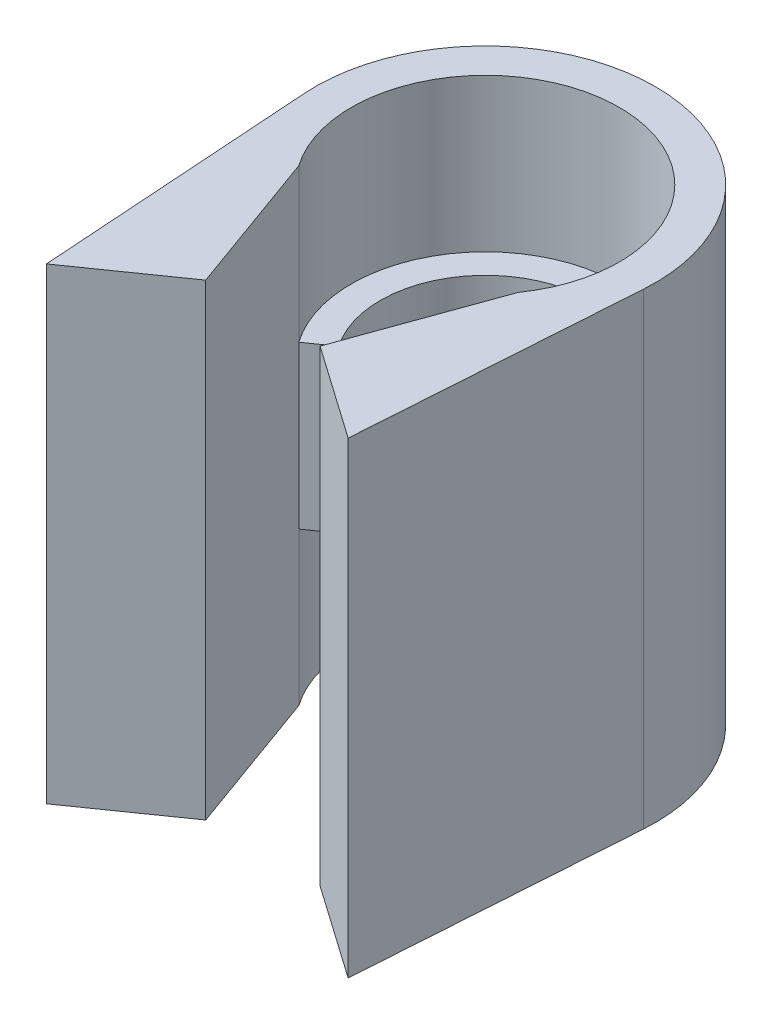
ISO-10303-21;
HEADER;
FILE_DESCRIPTION(('STEP AP214'),'2;1');
FILE_NAME('part.step','',(''),(''),'','','');
FILE_SCHEMA(('AUTOMOTIVE_DESIGN { 1 0 10303 214 1 1 1 1 }'));
ENDSEC;
DATA;
#1=APPLICATION_CONTEXT('core data for automotive mechanical design processes');
#2=APPLICATION_PROTOCOL_DEFINITION('international standard','automotive_design',2000,#1);
#3=PRODUCT_CONTEXT('',#1,'mechanical');
#4=PRODUCT('Part','Part','',(#3));
#5=PRODUCT_RELATED_PRODUCT_CATEGORY('part','',(#4));
#6=PRODUCT_DEFINITION_FORMATION('','',#4);
#7=PRODUCT_DEFINITION_CONTEXT('part definition',#1,'design');
#8=PRODUCT_DEFINITION('design','',#6,#7);
#9=PRODUCT_DEFINITION_SHAPE('','',#8);
#10=(LENGTH_UNIT() NAMED_UNIT(*) SI_UNIT(.MILLI.,.METRE.));
#11=(NAMED_UNIT(*) PLANE_ANGLE_UNIT() SI_UNIT($,.RADIAN.));
#12=(NAMED_UNIT(*) SI_UNIT($,.STERADIAN.) SOLID_ANGLE_UNIT());
#13=UNCERTAINTY_MEASURE_WITH_UNIT(LENGTH_MEASURE(1.E-05),#10,'distance_accuracy_value','');
#14=(GEOMETRIC_REPRESENTATION_CONTEXT(3) GLOBAL_UNCERTAINTY_ASSIGNED_CONTEXT((#13)) GLOBAL_UNIT_ASSIGNED_CONTEXT((#10,
#11,#12)) REPRESENTATION_CONTEXT('',''));
#15=CARTESIAN_POINT('',(0.,0.,0.));
#16=DIRECTION('',(0.,0.,1.));
#17=DIRECTION('',(1.,0.,0.));
#18=AXIS2_PLACEMENT_3D('',#15,#16,#17);
#19=CARTESIAN_POINT('',(0.,2.6,0.));
#20=DIRECTION('',(0.,-1.,0.));
#21=DIRECTION('',(0.,0.,-1.));
#22=AXIS2_PLACEMENT_3D('',#19,#20,#21);
#23=CYLINDRICAL_SURFACE('',#22,0.745);
#24=DIRECTION('',(0.,-1.,0.));
#25=VECTOR('',#24,1.);
#26=CARTESIAN_POINT('',(-0.6102682729953,2.6,0.427314445081528));
#27=LINE('',#26,#25);
#28=CARTESIAN_POINT('',(-0.6102682729953,2.6,0.427314445081528));
#29=VERTEX_POINT('',#28);
#30=CARTESIAN_POINT('',(-0.6102682729953,1.75,0.427314445081528));
#31=VERTEX_POINT('',#30);
#32=EDGE_CURVE('E174',#29,#31,#27,.T.);
#33=ORIENTED_EDGE('',*,*,#32,.T.);
#34=CARTESIAN_POINT('',(0.,1.75,0.));
#35=DIRECTION('',(0.,-1.,0.));
#36=DIRECTION('',(0.,0.,-1.));
#37=AXIS2_PLACEMENT_3D('',#34,#35,#36);
#38=CIRCLE('',#37,0.745);
#39=CARTESIAN_POINT('',(0.6102682729953,1.75,0.427314445081528));
#40=VERTEX_POINT('',#39);
#41=EDGE_CURVE('E209',#31,#40,#38,.T.);
#42=ORIENTED_EDGE('',*,*,#41,.T.);
#43=DIRECTION('',(0.,-1.,0.));
#44=VECTOR('',#43,1.);
#45=CARTESIAN_POINT('',(0.6102682729953,2.6,0.427314445081528));
#46=LINE('',#45,#44);
#47=CARTESIAN_POINT('',(0.6102682729953,2.6,0.427314445081528));
#48=VERTEX_POINT('',#47);
#49=EDGE_CURVE('E171',#48,#40,#46,.T.);
#50=ORIENTED_EDGE('',*,*,#49,.F.);
#51=CARTESIAN_POINT('',(0.,2.6,0.));
#52=DIRECTION('',(0.,1.,0.));
#53=DIRECTION('',(0.,0.,1.));
#54=AXIS2_PLACEMENT_3D('',#51,#52,#53);
#55=CIRCLE('',#54,0.745);
#56=EDGE_CURVE('E126',#48,#29,#55,.T.);
#57=ORIENTED_EDGE('',*,*,#56,.T.);
#58=EDGE_LOOP('',(#33,#42,#50,#57));
#59=FACE_BOUND('',#58,.T.);
#60=ADVANCED_FACE('F39',(#59),#23,.F.);
#61=CARTESIAN_POINT('',(0.,2.6,0.));
#62=DIRECTION('',(0.,-1.,0.));
#63=DIRECTION('',(0.,0.,-1.));
#64=AXIS2_PLACEMENT_3D('',#61,#62,#63);
#65=CYLINDRICAL_SURFACE('',#64,0.945);
#66=CARTESIAN_POINT('',(0.,0.,0.));
#67=DIRECTION('',(0.,1.,0.));
#68=DIRECTION('',(0.,0.,1.));
#69=AXIS2_PLACEMENT_3D('',#66,#67,#68);
#70=CIRCLE('',#69,0.945);
#71=CARTESIAN_POINT('',(-0.942848429511865,0.,0.0637325581395349));
#72=VERTEX_POINT('',#71);
#73=CARTESIAN_POINT('',(0.942848429511865,0.,0.0637325581395349));
#74=VERTEX_POINT('',#73);
#75=EDGE_CURVE('E147',#72,#74,#70,.F.);
#76=ORIENTED_EDGE('',*,*,#75,.F.);
#77=DIRECTION('',(0.,-1.,0.));
#78=VECTOR('',#77,1.);
#79=CARTESIAN_POINT('',(-0.942848429511865,2.6,0.0637325581395349));
#80=LINE('',#79,#78);
#81=CARTESIAN_POINT('',(-0.942848429511865,2.6,0.0637325581395349));
#82=VERTEX_POINT('',#81);
#83=EDGE_CURVE('E11',#82,#72,#80,.T.);
#84=ORIENTED_EDGE('',*,*,#83,.F.);
#85=CARTESIAN_POINT('',(0.,2.6,0.));
#86=DIRECTION('',(0.,1.,0.));
#87=DIRECTION('',(0.,0.,1.));
#88=AXIS2_PLACEMENT_3D('',#85,#86,#87);
#89=CIRCLE('',#88,0.945);
#90=CARTESIAN_POINT('',(0.942848429511865,2.6,0.0637325581395349));
#91=VERTEX_POINT('',#90);
#92=EDGE_CURVE('E168',#82,#91,#89,.F.);
#93=ORIENTED_EDGE('',*,*,#92,.T.);
#94=DIRECTION('',(0.,-1.,0.));
#95=VECTOR('',#94,1.);
#96=CARTESIAN_POINT('',(0.942848429511865,2.6,0.0637325581395349));
#97=LINE('',#96,#95);
#98=EDGE_CURVE('E63',#91,#74,#97,.T.);
#99=ORIENTED_EDGE('',*,*,#98,.T.);
#100=EDGE_LOOP('',(#76,#84,#93,#99));
#101=FACE_BOUND('',#100,.T.);
#102=ADVANCED_FACE('F41',(#101),#65,.T.);
#103=CARTESIAN_POINT('',(-0.942848429511865,2.6,0.0637325581395349));
#104=DIRECTION('',(0.997723205832662,0.,-0.0674418604651163));
#105=DIRECTION('',(-0.0674418604651162,0.,-0.997723205832662));
#106=AXIS2_PLACEMENT_3D('',#103,#104,#105);
#107=PLANE('',#106);
#108=DIRECTION('',(0.0674418604651163,0.,0.997723205832662));
#109=VECTOR('',#108,1.);
#110=CARTESIAN_POINT('',(-0.942848429511865,0.,0.0637325581395349));
#111=LINE('',#110,#109);
#112=CARTESIAN_POINT('',(-0.838876724693396,0.,1.60187195601434));
#113=VERTEX_POINT('',#112);
#114=EDGE_CURVE('E149',#72,#113,#111,.T.);
#115=ORIENTED_EDGE('',*,*,#114,.T.);
#116=DIRECTION('',(0.,-1.,0.));
#117=VECTOR('',#116,1.);
#118=CARTESIAN_POINT('',(-0.838876724693396,2.6,1.60187195601434));
#119=LINE('',#118,#117);
#120=CARTESIAN_POINT('',(-0.838876724693396,2.6,1.60187195601434));
#121=VERTEX_POINT('',#120);
#122=EDGE_CURVE('E47',#121,#113,#119,.T.);
#123=ORIENTED_EDGE('',*,*,#122,.F.);
#124=DIRECTION('',(0.0674418604651163,0.,0.997723205832662));
#125=VECTOR('',#124,1.);
#126=CARTESIAN_POINT('',(-0.942848429511865,2.6,0.0637325581395349));
#127=LINE('',#126,#125);
#128=EDGE_CURVE('E199',#82,#121,#127,.T.);
#129=ORIENTED_EDGE('',*,*,#128,.F.);
#130=ORIENTED_EDGE('',*,*,#83,.T.);
#131=EDGE_LOOP('',(#115,#123,#129,#130));
#132=FACE_BOUND('',#131,.T.);
#133=ADVANCED_FACE('F187',(#132),#107,.F.);
#134=CARTESIAN_POINT('',(0.476651634714688,2.6,0.680729082028155));
#135=DIRECTION('',(0.573576436351044,0.,0.819152044288993));
#136=DIRECTION('',(0.819152044288993,0.,-0.573576436351044));
#137=AXIS2_PLACEMENT_3D('',#134,#135,#136);
#138=PLANE('',#137);
#139=DIRECTION('',(-0.819152044288993,0.,0.573576436351044));
#140=VECTOR('',#139,1.);
#141=CARTESIAN_POINT('',(0.476651634714688,0.,0.680729082028155));
#142=LINE('',#141,#140);
#143=CARTESIAN_POINT('',(-0.317859347068842,0.,1.23705166066338));
#144=VERTEX_POINT('',#143);
#145=EDGE_CURVE('E153',#144,#113,#142,.T.);
#146=ORIENTED_EDGE('',*,*,#145,.F.);
#147=DIRECTION('',(0.,-1.,0.));
#148=VECTOR('',#147,1.);
#149=CARTESIAN_POINT('',(-0.317859347068842,2.6,1.23705166066338));
#150=LINE('',#149,#148);
#151=CARTESIAN_POINT('',(-0.317859347068842,2.6,1.23705166066338));
#152=VERTEX_POINT('',#151);
#153=EDGE_CURVE('E177',#152,#144,#150,.T.);
#154=ORIENTED_EDGE('',*,*,#153,.F.);
#155=DIRECTION('',(-0.819152044288993,0.,0.573576436351044));
#156=VECTOR('',#155,1.);
#157=CARTESIAN_POINT('',(0.476651634714688,2.6,0.680729082028155));
#158=LINE('',#157,#156);
#159=EDGE_CURVE('E184',#152,#121,#158,.T.);
#160=ORIENTED_EDGE('',*,*,#159,.T.);
#161=ORIENTED_EDGE('',*,*,#122,.T.);
#162=EDGE_LOOP('',(#146,#154,#160,#161));
#163=FACE_BOUND('',#162,.T.);
#164=ADVANCED_FACE('F182',(#163),#138,.T.);
#165=CARTESIAN_POINT('',(-0.676375746077062,2.6,0.244249988301432));
#166=DIRECTION('',(0.94055248211324,0.,-0.339648389353789));
#167=DIRECTION('',(-0.339648389353789,0.,-0.94055248211324));
#168=AXIS2_PLACEMENT_3D('',#165,#166,#167);
#169=PLANE('',#168);
#170=DIRECTION('',(0.339648389353789,0.,0.94055248211324));
#171=VECTOR('',#170,1.);
#172=CARTESIAN_POINT('',(-0.676375746077062,0.,0.244249988301432));
#173=LINE('',#172,#171);
#174=CARTESIAN_POINT('',(-0.6102682729953,0.,0.427314445081528));
#175=VERTEX_POINT('',#174);
#176=EDGE_CURVE('E156',#175,#144,#173,.T.);
#177=ORIENTED_EDGE('',*,*,#176,.F.);
#178=CARTESIAN_POINT('',(-0.6102682729953,0.85,0.427314445081528));
#179=VERTEX_POINT('',#178);
#180=EDGE_CURVE('E173',#179,#175,#27,.T.);
#181=ORIENTED_EDGE('',*,*,#180,.F.);
#182=DIRECTION('',(0.,-1.,0.));
#183=VECTOR('',#182,1.);
#184=CARTESIAN_POINT('',(-0.6102682729953,1.75,0.427314445081528));
#185=LINE('',#184,#183);
#186=EDGE_CURVE('E228',#31,#179,#185,.T.);
#187=ORIENTED_EDGE('',*,*,#186,.F.);
#188=ORIENTED_EDGE('',*,*,#32,.F.);
#189=DIRECTION('',(0.339648389353789,0.,0.94055248211324));
#190=VECTOR('',#189,1.);
#191=CARTESIAN_POINT('',(-0.676375746077062,2.6,0.244249988301432));
#192=LINE('',#191,#190);
#193=EDGE_CURVE('E198',#29,#152,#192,.T.);
#194=ORIENTED_EDGE('',*,*,#193,.T.);
#195=ORIENTED_EDGE('',*,*,#153,.T.);
#196=EDGE_LOOP('',(#177,#181,#187,#188,#194,#195));
#197=FACE_BOUND('',#196,.T.);
#198=ADVANCED_FACE('F194',(#197),#169,.T.);
#199=CARTESIAN_POINT('',(0.,0.85,0.));
#200=DIRECTION('',(0.,-1.,0.));
#201=DIRECTION('',(0.,0.,-1.));
#202=AXIS2_PLACEMENT_3D('',#199,#200,#201);
#203=CIRCLE('',#202,0.745);
#204=CARTESIAN_POINT('',(0.6102682729953,0.85,0.427314445081528));
#205=VERTEX_POINT('',#204);
#206=EDGE_CURVE('E241',#179,#205,#203,.T.);
#207=ORIENTED_EDGE('',*,*,#206,.F.);
#208=ORIENTED_EDGE('',*,*,#180,.T.);
#209=CARTESIAN_POINT('',(0.,0.,0.));
#210=DIRECTION('',(0.,1.,0.));
#211=DIRECTION('',(0.,0.,1.));
#212=AXIS2_PLACEMENT_3D('',#209,#210,#211);
#213=CIRCLE('',#212,0.745);
#214=CARTESIAN_POINT('',(0.6102682729953,0.,0.427314445081528));
#215=VERTEX_POINT('',#214);
#216=EDGE_CURVE('E159',#215,#175,#213,.T.);
#217=ORIENTED_EDGE('',*,*,#216,.F.);
#218=EDGE_CURVE('E138',#205,#215,#46,.T.);
#219=ORIENTED_EDGE('',*,*,#218,.F.);
#220=EDGE_LOOP('',(#207,#208,#217,#219));
#221=FACE_BOUND('',#220,.T.);
#222=ADVANCED_FACE('F247',(#221),#23,.F.);
#223=CARTESIAN_POINT('',(0.676375746077062,2.6,0.244249988301432));
#224=DIRECTION('',(0.94055248211324,0.,0.339648389353789));
#225=DIRECTION('',(0.339648389353789,0.,-0.94055248211324));
#226=AXIS2_PLACEMENT_3D('',#223,#224,#225);
#227=PLANE('',#226);
#228=DIRECTION('',(-0.339648389353789,0.,0.94055248211324));
#229=VECTOR('',#228,1.);
#230=CARTESIAN_POINT('',(0.676375746077062,0.,0.244249988301432));
#231=LINE('',#230,#229);
#232=CARTESIAN_POINT('',(0.317859347068842,0.,1.23705166066338));
#233=VERTEX_POINT('',#232);
#234=EDGE_CURVE('E134',#215,#233,#231,.T.);
#235=ORIENTED_EDGE('',*,*,#234,.T.);
#236=DIRECTION('',(0.,-1.,0.));
#237=VECTOR('',#236,1.);
#238=CARTESIAN_POINT('',(0.317859347068842,2.6,1.23705166066338));
#239=LINE('',#238,#237);
#240=CARTESIAN_POINT('',(0.317859347068842,2.6,1.23705166066338));
#241=VERTEX_POINT('',#240);
#242=EDGE_CURVE('E131',#241,#233,#239,.T.);
#243=ORIENTED_EDGE('',*,*,#242,.F.);
#244=DIRECTION('',(-0.339648389353789,0.,0.94055248211324));
#245=VECTOR('',#244,1.);
#246=CARTESIAN_POINT('',(0.676375746077062,2.6,0.244249988301432));
#247=LINE('',#246,#245);
#248=EDGE_CURVE('E116',#48,#241,#247,.T.);
#249=ORIENTED_EDGE('',*,*,#248,.F.);
#250=ORIENTED_EDGE('',*,*,#49,.T.);
#251=DIRECTION('',(0.,-1.,0.));
#252=VECTOR('',#251,1.);
#253=CARTESIAN_POINT('',(0.6102682729953,1.75,0.427314445081528));
#254=LINE('',#253,#252);
#255=EDGE_CURVE('E211',#40,#205,#254,.T.);
#256=ORIENTED_EDGE('',*,*,#255,.T.);
#257=ORIENTED_EDGE('',*,*,#218,.T.);
#258=EDGE_LOOP('',(#235,#243,#249,#250,#256,#257));
#259=FACE_BOUND('',#258,.T.);
#260=ADVANCED_FACE('F132',(#259),#227,.F.);
#261=CARTESIAN_POINT('',(-0.476651634714688,2.6,0.680729082028155));
#262=DIRECTION('',(0.573576436351044,0.,-0.819152044288993));
#263=DIRECTION('',(-0.819152044288993,0.,-0.573576436351044));
#264=AXIS2_PLACEMENT_3D('',#261,#262,#263);
#265=PLANE('',#264);
#266=DIRECTION('',(0.819152044288993,0.,0.573576436351044));
#267=VECTOR('',#266,1.);
#268=CARTESIAN_POINT('',(-0.476651634714688,0.,0.680729082028155));
#269=LINE('',#268,#267);
#270=CARTESIAN_POINT('',(0.838876724693396,0.,1.60187195601434));
#271=VERTEX_POINT('',#270);
#272=EDGE_CURVE('E163',#233,#271,#269,.T.);
#273=ORIENTED_EDGE('',*,*,#272,.T.);
#274=DIRECTION('',(0.,-1.,0.));
#275=VECTOR('',#274,1.);
#276=CARTESIAN_POINT('',(0.838876724693396,2.6,1.60187195601434));
#277=LINE('',#276,#275);
#278=CARTESIAN_POINT('',(0.838876724693396,2.6,1.60187195601434));
#279=VERTEX_POINT('',#278);
#280=EDGE_CURVE('E139',#279,#271,#277,.T.);
#281=ORIENTED_EDGE('',*,*,#280,.F.);
#282=DIRECTION('',(0.819152044288993,0.,0.573576436351044));
#283=VECTOR('',#282,1.);
#284=CARTESIAN_POINT('',(-0.476651634714688,2.6,0.680729082028155));
#285=LINE('',#284,#283);
#286=EDGE_CURVE('E122',#241,#279,#285,.T.);
#287=ORIENTED_EDGE('',*,*,#286,.F.);
#288=ORIENTED_EDGE('',*,*,#242,.T.);
#289=EDGE_LOOP('',(#273,#281,#287,#288));
#290=FACE_BOUND('',#289,.T.);
#291=ADVANCED_FACE('F141',(#290),#265,.F.);
#292=CARTESIAN_POINT('',(0.942848429511865,2.6,0.0637325581395349));
#293=DIRECTION('',(0.997723205832662,0.,0.0674418604651163));
#294=DIRECTION('',(0.0674418604651162,0.,-0.997723205832662));
#295=AXIS2_PLACEMENT_3D('',#292,#293,#294);
#296=PLANE('',#295);
#297=DIRECTION('',(-0.0674418604651163,0.,0.997723205832662));
#298=VECTOR('',#297,1.);
#299=CARTESIAN_POINT('',(0.942848429511865,0.,0.0637325581395349));
#300=LINE('',#299,#298);
#301=EDGE_CURVE('E165',#74,#271,#300,.T.);
#302=ORIENTED_EDGE('',*,*,#301,.F.);
#303=ORIENTED_EDGE('',*,*,#98,.F.);
#304=DIRECTION('',(-0.0674418604651163,0.,0.997723205832662));
#305=VECTOR('',#304,1.);
#306=CARTESIAN_POINT('',(0.942848429511865,2.6,0.0637325581395349));
#307=LINE('',#306,#305);
#308=EDGE_CURVE('E142',#91,#279,#307,.T.);
#309=ORIENTED_EDGE('',*,*,#308,.T.);
#310=ORIENTED_EDGE('',*,*,#280,.T.);
#311=EDGE_LOOP('',(#302,#303,#309,#310));
#312=FACE_BOUND('',#311,.T.);
#313=ADVANCED_FACE('F260',(#312),#296,.T.);
#314=CARTESIAN_POINT('',(0.,2.6,0.));
#315=DIRECTION('',(0.,1.,0.));
#316=DIRECTION('',(0.,0.,1.));
#317=AXIS2_PLACEMENT_3D('',#314,#315,#316);
#318=PLANE('',#317);
#319=ORIENTED_EDGE('',*,*,#92,.F.);
#320=ORIENTED_EDGE('',*,*,#128,.T.);
#321=ORIENTED_EDGE('',*,*,#159,.F.);
#322=ORIENTED_EDGE('',*,*,#193,.F.);
#323=ORIENTED_EDGE('',*,*,#56,.F.);
#324=ORIENTED_EDGE('',*,*,#248,.T.);
#325=ORIENTED_EDGE('',*,*,#286,.T.);
#326=ORIENTED_EDGE('',*,*,#308,.F.);
#327=EDGE_LOOP('',(#319,#320,#321,#322,#323,#324,#325,#326));
#328=FACE_BOUND('',#327,.T.);
#329=ADVANCED_FACE('F119',(#328),#318,.T.);
#330=CARTESIAN_POINT('',(0.,0.,0.));
#331=DIRECTION('',(0.,1.,0.));
#332=DIRECTION('',(0.,0.,1.));
#333=AXIS2_PLACEMENT_3D('',#330,#331,#332);
#334=PLANE('',#333);
#335=ORIENTED_EDGE('',*,*,#75,.T.);
#336=ORIENTED_EDGE('',*,*,#301,.T.);
#337=ORIENTED_EDGE('',*,*,#272,.F.);
#338=ORIENTED_EDGE('',*,*,#234,.F.);
#339=ORIENTED_EDGE('',*,*,#216,.T.);
#340=ORIENTED_EDGE('',*,*,#176,.T.);
#341=ORIENTED_EDGE('',*,*,#145,.T.);
#342=ORIENTED_EDGE('',*,*,#114,.F.);
#343=EDGE_LOOP('',(#335,#336,#337,#338,#339,#340,#341,#342));
#344=FACE_BOUND('',#343,.T.);
#345=ADVANCED_FACE('F189',(#344),#334,.F.);
#346=CARTESIAN_POINT('',(0.,1.75,0.));
#347=DIRECTION('',(0.573576436351044,0.,0.819152044288993));
#348=DIRECTION('',(0.819152044288993,0.,-0.573576436351044));
#349=AXIS2_PLACEMENT_3D('',#346,#347,#348);
#350=PLANE('',#349);
#351=ORIENTED_EDGE('',*,*,#186,.T.);
#352=DIRECTION('',(-0.819152044288993,0.,0.573576436351044));
#353=VECTOR('',#352,1.);
#354=CARTESIAN_POINT('',(0.,0.85,0.));
#355=LINE('',#354,#353);
#356=CARTESIAN_POINT('',(-0.479203945909061,0.85,0.335542215265361));
#357=VERTEX_POINT('',#356);
#358=EDGE_CURVE('E232',#357,#179,#355,.T.);
#359=ORIENTED_EDGE('',*,*,#358,.F.);
#360=DIRECTION('',(0.,-1.,0.));
#361=VECTOR('',#360,1.);
#362=CARTESIAN_POINT('',(-0.479203945909061,1.75,0.335542215265361));
#363=LINE('',#362,#361);
#364=CARTESIAN_POINT('',(-0.479203945909061,1.75,0.335542215265361));
#365=VERTEX_POINT('',#364);
#366=EDGE_CURVE('E150',#365,#357,#363,.T.);
#367=ORIENTED_EDGE('',*,*,#366,.F.);
#368=DIRECTION('',(-0.819152044288993,0.,0.573576436351044));
#369=VECTOR('',#368,1.);
#370=CARTESIAN_POINT('',(0.,1.75,0.));
#371=LINE('',#370,#369);
#372=EDGE_CURVE('E235',#365,#31,#371,.T.);
#373=ORIENTED_EDGE('',*,*,#372,.T.);
#374=EDGE_LOOP('',(#351,#359,#367,#373));
#375=FACE_BOUND('',#374,.T.);
#376=ADVANCED_FACE('F230',(#375),#350,.T.);
#377=CARTESIAN_POINT('',(0.,1.75,0.));
#378=DIRECTION('',(0.,-1.,0.));
#379=DIRECTION('',(0.,0.,-1.));
#380=AXIS2_PLACEMENT_3D('',#377,#378,#379);
#381=CYLINDRICAL_SURFACE('',#380,0.585);
#382=ORIENTED_EDGE('',*,*,#366,.T.);
#383=CARTESIAN_POINT('',(0.,0.85,0.));
#384=DIRECTION('',(0.,-1.,0.));
#385=DIRECTION('',(0.,0.,-1.));
#386=AXIS2_PLACEMENT_3D('',#383,#384,#385);
#387=CIRCLE('',#386,0.585);
#388=CARTESIAN_POINT('',(0.479203945909061,0.85,0.335542215265361));
#389=VERTEX_POINT('',#388);
#390=EDGE_CURVE('E244',#357,#389,#387,.T.);
#391=ORIENTED_EDGE('',*,*,#390,.T.);
#392=DIRECTION('',(0.,-1.,0.));
#393=VECTOR('',#392,1.);
#394=CARTESIAN_POINT('',(0.479203945909061,1.75,0.335542215265361));
#395=LINE('',#394,#393);
#396=CARTESIAN_POINT('',(0.479203945909061,1.75,0.335542215265361));
#397=VERTEX_POINT('',#396);
#398=EDGE_CURVE('E258',#397,#389,#395,.T.);
#399=ORIENTED_EDGE('',*,*,#398,.F.);
#400=CARTESIAN_POINT('',(0.,1.75,0.));
#401=DIRECTION('',(0.,-1.,0.));
#402=DIRECTION('',(0.,0.,-1.));
#403=AXIS2_PLACEMENT_3D('',#400,#401,#402);
#404=CIRCLE('',#403,0.585);
#405=EDGE_CURVE('E236',#365,#397,#404,.T.);
#406=ORIENTED_EDGE('',*,*,#405,.F.);
#407=EDGE_LOOP('',(#382,#391,#399,#406));
#408=FACE_BOUND('',#407,.T.);
#409=ADVANCED_FACE('F345',(#408),#381,.F.);
#410=CARTESIAN_POINT('',(0.,1.75,0.));
#411=DIRECTION('',(-0.573576436351044,0.,0.819152044288993));
#412=DIRECTION('',(0.819152044288993,0.,0.573576436351044));
#413=AXIS2_PLACEMENT_3D('',#410,#411,#412);
#414=PLANE('',#413);
#415=ORIENTED_EDGE('',*,*,#398,.T.);
#416=DIRECTION('',(-0.819152044288993,0.,-0.573576436351044));
#417=VECTOR('',#416,1.);
#418=CARTESIAN_POINT('',(0.,0.85,0.));
#419=LINE('',#418,#417);
#420=EDGE_CURVE('E54',#205,#389,#419,.T.);
#421=ORIENTED_EDGE('',*,*,#420,.F.);
#422=ORIENTED_EDGE('',*,*,#255,.F.);
#423=DIRECTION('',(-0.819152044288993,0.,-0.573576436351044));
#424=VECTOR('',#423,1.);
#425=CARTESIAN_POINT('',(0.,1.75,0.));
#426=LINE('',#425,#424);
#427=EDGE_CURVE('E254',#40,#397,#426,.T.);
#428=ORIENTED_EDGE('',*,*,#427,.T.);
#429=EDGE_LOOP('',(#415,#421,#422,#428));
#430=FACE_BOUND('',#429,.T.);
#431=ADVANCED_FACE('F354',(#430),#414,.T.);
#432=CARTESIAN_POINT('',(0.,1.75,0.));
#433=DIRECTION('',(0.,-1.,0.));
#434=DIRECTION('',(0.,0.,-1.));
#435=AXIS2_PLACEMENT_3D('',#432,#433,#434);
#436=PLANE('',#435);
#437=ORIENTED_EDGE('',*,*,#372,.F.);
#438=ORIENTED_EDGE('',*,*,#405,.T.);
#439=ORIENTED_EDGE('',*,*,#427,.F.);
#440=ORIENTED_EDGE('',*,*,#41,.F.);
#441=EDGE_LOOP('',(#437,#438,#439,#440));
#442=FACE_BOUND('',#441,.T.);
#443=ADVANCED_FACE('F364',(#442),#436,.F.);
#444=CARTESIAN_POINT('',(0.,0.85,0.));
#445=DIRECTION('',(0.,-1.,0.));
#446=DIRECTION('',(0.,0.,-1.));
#447=AXIS2_PLACEMENT_3D('',#444,#445,#446);
#448=PLANE('',#447);
#449=ORIENTED_EDGE('',*,*,#358,.T.);
#450=ORIENTED_EDGE('',*,*,#206,.T.);
#451=ORIENTED_EDGE('',*,*,#420,.T.);
#452=ORIENTED_EDGE('',*,*,#390,.F.);
#453=EDGE_LOOP('',(#449,#450,#451,#452));
#454=FACE_BOUND('',#453,.T.);
#455=ADVANCED_FACE('F240',(#454),#448,.T.);
#456=CLOSED_SHELL('',(#60,#102,#133,#164,#198,#222,#260,#291,#313,#329,#345,#376,#409,#431,#443,#455));
#457=MANIFOLD_SOLID_BREP('B2',#456);
#458=ADVANCED_BREP_SHAPE_REPRESENTATION('',(#18,#457),#14);
#459=SHAPE_DEFINITION_REPRESENTATION(#9,#458);
ENDSEC;
END-ISO-10303-21;
